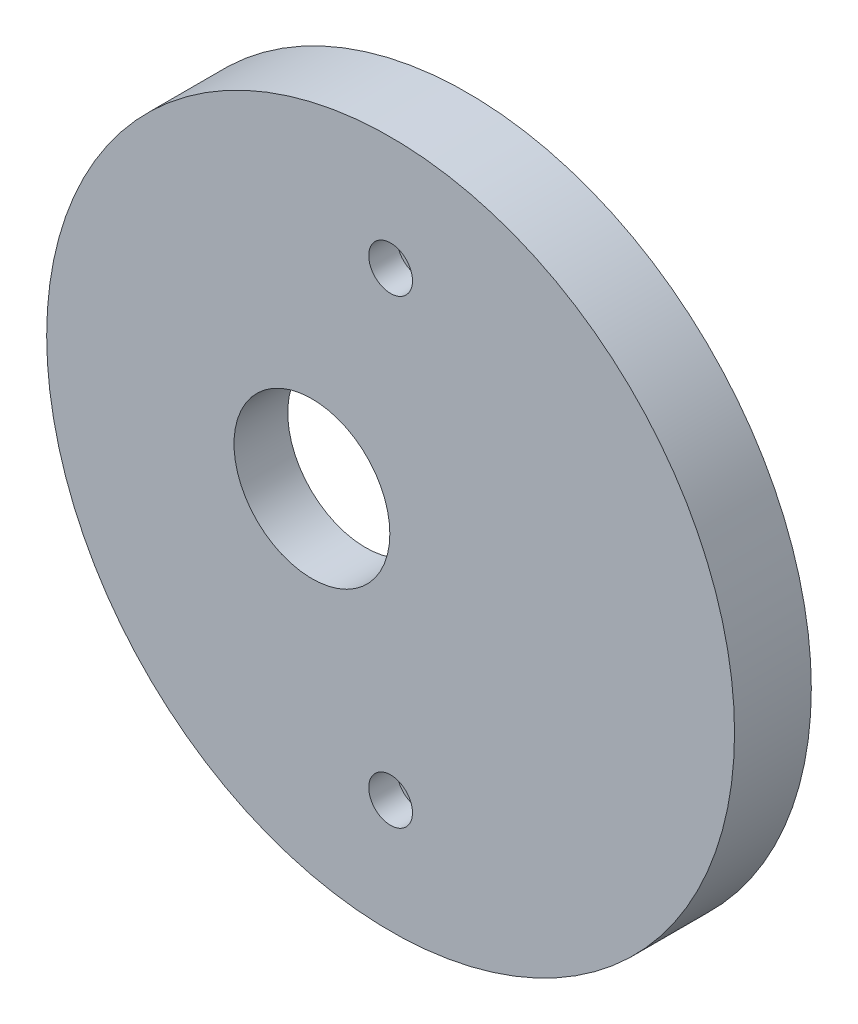
ISO-10303-21;
HEADER;
FILE_DESCRIPTION(('STEP AP214'),'2;1');
FILE_NAME('part.step','',(''),(''),'','','');
FILE_SCHEMA(('AUTOMOTIVE_DESIGN { 1 0 10303 214 1 1 1 1 }'));
ENDSEC;
DATA;
#1=APPLICATION_CONTEXT('core data for automotive mechanical design processes');
#2=APPLICATION_PROTOCOL_DEFINITION('international standard','automotive_design',2000,#1);
#3=PRODUCT_CONTEXT('',#1,'mechanical');
#4=PRODUCT('Part','Part','',(#3));
#5=PRODUCT_RELATED_PRODUCT_CATEGORY('part','',(#4));
#6=PRODUCT_DEFINITION_FORMATION('','',#4);
#7=PRODUCT_DEFINITION_CONTEXT('part definition',#1,'design');
#8=PRODUCT_DEFINITION('design','',#6,#7);
#9=PRODUCT_DEFINITION_SHAPE('','',#8);
#10=(LENGTH_UNIT() NAMED_UNIT(*) SI_UNIT(.MILLI.,.METRE.));
#11=(NAMED_UNIT(*) PLANE_ANGLE_UNIT() SI_UNIT($,.RADIAN.));
#12=(NAMED_UNIT(*) SI_UNIT($,.STERADIAN.) SOLID_ANGLE_UNIT());
#13=UNCERTAINTY_MEASURE_WITH_UNIT(LENGTH_MEASURE(1.E-05),#10,'distance_accuracy_value','');
#14=(GEOMETRIC_REPRESENTATION_CONTEXT(3) GLOBAL_UNCERTAINTY_ASSIGNED_CONTEXT((#13)) GLOBAL_UNIT_ASSIGNED_CONTEXT((#10,
#11,#12)) REPRESENTATION_CONTEXT('',''));
#15=CARTESIAN_POINT('',(0.,0.,0.));
#16=DIRECTION('',(0.,0.,1.));
#17=DIRECTION('',(1.,0.,0.));
#18=AXIS2_PLACEMENT_3D('',#15,#16,#17);
#19=CARTESIAN_POINT('',(0.,30.,7.));
#20=DIRECTION('',(0.,0.,-1.));
#21=DIRECTION('',(-1.,0.,0.));
#22=AXIS2_PLACEMENT_3D('',#19,#20,#21);
#23=CYLINDRICAL_SURFACE('',#22,1.8);
#24=CARTESIAN_POINT('',(0.,30.,0.));
#25=DIRECTION('',(0.,0.,1.));
#26=DIRECTION('',(1.,0.,0.));
#27=AXIS2_PLACEMENT_3D('',#24,#25,#26);
#28=CIRCLE('',#27,1.8);
#29=CARTESIAN_POINT('',(1.8,30.,0.));
#30=VERTEX_POINT('',#29);
#31=EDGE_CURVE('E89',#30,#30,#28,.T.);
#32=ORIENTED_EDGE('',*,*,#31,.F.);
#33=EDGE_LOOP('',(#32));
#34=FACE_BOUND('',#33,.T.);
#35=CARTESIAN_POINT('',(0.,30.,3.3));
#36=DIRECTION('',(0.,0.,1.));
#37=DIRECTION('',(1.,0.,0.));
#38=AXIS2_PLACEMENT_3D('',#35,#36,#37);
#39=CIRCLE('',#38,1.8);
#40=CARTESIAN_POINT('',(1.8,30.,3.3));
#41=VERTEX_POINT('',#40);
#42=EDGE_CURVE('E45',#41,#41,#39,.T.);
#43=ORIENTED_EDGE('',*,*,#42,.T.);
#44=EDGE_LOOP('',(#43));
#45=FACE_BOUND('',#44,.T.);
#46=ADVANCED_FACE('F41',(#34,#45),#23,.F.);
#47=CARTESIAN_POINT('',(0.,-30.,7.));
#48=DIRECTION('',(0.,0.,-1.));
#49=DIRECTION('',(-1.,0.,0.));
#50=AXIS2_PLACEMENT_3D('',#47,#48,#49);
#51=CYLINDRICAL_SURFACE('',#50,1.8);
#52=CARTESIAN_POINT('',(0.,-30.,0.));
#53=DIRECTION('',(0.,0.,1.));
#54=DIRECTION('',(-1.,0.,0.));
#55=AXIS2_PLACEMENT_3D('',#52,#53,#54);
#56=CIRCLE('',#55,1.8);
#57=CARTESIAN_POINT('',(-1.8,-30.,0.));
#58=VERTEX_POINT('',#57);
#59=EDGE_CURVE('E86',#58,#58,#56,.T.);
#60=ORIENTED_EDGE('',*,*,#59,.F.);
#61=EDGE_LOOP('',(#60));
#62=FACE_BOUND('',#61,.T.);
#63=CARTESIAN_POINT('',(0.,-30.,3.3));
#64=DIRECTION('',(0.,0.,1.));
#65=DIRECTION('',(1.,0.,0.));
#66=AXIS2_PLACEMENT_3D('',#63,#64,#65);
#67=CIRCLE('',#66,1.8);
#68=CARTESIAN_POINT('',(1.8,-30.,3.3));
#69=VERTEX_POINT('',#68);
#70=EDGE_CURVE('E57',#69,#69,#67,.T.);
#71=ORIENTED_EDGE('',*,*,#70,.T.);
#72=EDGE_LOOP('',(#71));
#73=FACE_BOUND('',#72,.T.);
#74=ADVANCED_FACE('F117',(#62,#73),#51,.F.);
#75=CARTESIAN_POINT('',(0.,0.,0.));
#76=DIRECTION('',(0.,0.,1.));
#77=DIRECTION('',(1.,0.,0.));
#78=AXIS2_PLACEMENT_3D('',#75,#76,#77);
#79=PLANE('',#78);
#80=ORIENTED_EDGE('',*,*,#59,.T.);
#81=EDGE_LOOP('',(#80));
#82=FACE_BOUND('',#81,.T.);
#83=ORIENTED_EDGE('',*,*,#31,.T.);
#84=EDGE_LOOP('',(#83));
#85=FACE_BOUND('',#84,.T.);
#86=CARTESIAN_POINT('',(-10.25,0.,0.));
#87=DIRECTION('',(0.,0.,1.));
#88=DIRECTION('',(1.,0.,0.));
#89=AXIS2_PLACEMENT_3D('',#86,#87,#88);
#90=CIRCLE('',#89,10.15);
#91=CARTESIAN_POINT('',(-0.0999999999999994,0.,0.));
#92=VERTEX_POINT('',#91);
#93=EDGE_CURVE('E54',#92,#92,#90,.T.);
#94=ORIENTED_EDGE('',*,*,#93,.T.);
#95=EDGE_LOOP('',(#94));
#96=FACE_BOUND('',#95,.T.);
#97=CARTESIAN_POINT('',(0.,0.,0.));
#98=DIRECTION('',(0.,0.,-1.));
#99=DIRECTION('',(-1.,0.,0.));
#100=AXIS2_PLACEMENT_3D('',#97,#98,#99);
#101=CIRCLE('',#100,33.5);
#102=CARTESIAN_POINT('',(-33.5,0.,0.));
#103=VERTEX_POINT('',#102);
#104=EDGE_CURVE('E63',#103,#103,#101,.T.);
#105=ORIENTED_EDGE('',*,*,#104,.T.);
#106=EDGE_LOOP('',(#105));
#107=FACE_BOUND('',#106,.T.);
#108=ADVANCED_FACE('F96',(#82,#85,#96,#107),#79,.F.);
#109=CARTESIAN_POINT('',(0.,0.,7.));
#110=DIRECTION('',(0.,0.,1.));
#111=DIRECTION('',(1.,0.,0.));
#112=AXIS2_PLACEMENT_3D('',#109,#110,#111);
#113=PLANE('',#112);
#114=CARTESIAN_POINT('',(0.,30.,7.));
#115=DIRECTION('',(0.,0.,1.));
#116=DIRECTION('',(1.,0.,0.));
#117=AXIS2_PLACEMENT_3D('',#114,#115,#116);
#118=CIRCLE('',#117,2.85);
#119=CARTESIAN_POINT('',(2.85,30.,7.));
#120=VERTEX_POINT('',#119);
#121=EDGE_CURVE('E65',#120,#120,#118,.T.);
#122=ORIENTED_EDGE('',*,*,#121,.F.);
#123=EDGE_LOOP('',(#122));
#124=FACE_BOUND('',#123,.T.);
#125=CARTESIAN_POINT('',(0.,-30.,7.));
#126=DIRECTION('',(0.,0.,1.));
#127=DIRECTION('',(1.,0.,0.));
#128=AXIS2_PLACEMENT_3D('',#125,#126,#127);
#129=CIRCLE('',#128,2.85);
#130=CARTESIAN_POINT('',(2.85,-30.,7.));
#131=VERTEX_POINT('',#130);
#132=EDGE_CURVE('E70',#131,#131,#129,.T.);
#133=ORIENTED_EDGE('',*,*,#132,.F.);
#134=EDGE_LOOP('',(#133));
#135=FACE_BOUND('',#134,.T.);
#136=CARTESIAN_POINT('',(0.,0.,7.));
#137=DIRECTION('',(0.,0.,1.));
#138=DIRECTION('',(1.,0.,0.));
#139=AXIS2_PLACEMENT_3D('',#136,#137,#138);
#140=CIRCLE('',#139,44.8);
#141=CARTESIAN_POINT('',(44.8,0.,7.));
#142=VERTEX_POINT('',#141);
#143=EDGE_CURVE('E10',#142,#142,#140,.T.);
#144=ORIENTED_EDGE('',*,*,#143,.T.);
#145=EDGE_LOOP('',(#144));
#146=FACE_BOUND('',#145,.T.);
#147=CARTESIAN_POINT('',(-10.25,0.,7.));
#148=DIRECTION('',(0.,0.,1.));
#149=DIRECTION('',(1.,0.,0.));
#150=AXIS2_PLACEMENT_3D('',#147,#148,#149);
#151=CIRCLE('',#150,10.15);
#152=CARTESIAN_POINT('',(-0.0999999999999994,0.,7.));
#153=VERTEX_POINT('',#152);
#154=EDGE_CURVE('E49',#153,#153,#151,.T.);
#155=ORIENTED_EDGE('',*,*,#154,.F.);
#156=EDGE_LOOP('',(#155));
#157=FACE_BOUND('',#156,.T.);
#158=ADVANCED_FACE('F112',(#124,#135,#146,#157),#113,.T.);
#159=CARTESIAN_POINT('',(0.,0.,7.));
#160=DIRECTION('',(0.,0.,-1.));
#161=DIRECTION('',(-1.,0.,0.));
#162=AXIS2_PLACEMENT_3D('',#159,#160,#161);
#163=CYLINDRICAL_SURFACE('',#162,44.8);
#164=ORIENTED_EDGE('',*,*,#143,.F.);
#165=EDGE_LOOP('',(#164));
#166=FACE_BOUND('',#165,.T.);
#167=CARTESIAN_POINT('',(0.,0.,-3.));
#168=DIRECTION('',(0.,0.,-1.));
#169=DIRECTION('',(-1.,0.,0.));
#170=AXIS2_PLACEMENT_3D('',#167,#168,#169);
#171=CIRCLE('',#170,44.8);
#172=CARTESIAN_POINT('',(-44.8,0.,-3.));
#173=VERTEX_POINT('',#172);
#174=EDGE_CURVE('E81',#173,#173,#171,.T.);
#175=ORIENTED_EDGE('',*,*,#174,.F.);
#176=EDGE_LOOP('',(#175));
#177=FACE_BOUND('',#176,.T.);
#178=ADVANCED_FACE('F43',(#166,#177),#163,.T.);
#179=CARTESIAN_POINT('',(-10.25,0.,7.));
#180=DIRECTION('',(0.,0.,-1.));
#181=DIRECTION('',(-1.,0.,0.));
#182=AXIS2_PLACEMENT_3D('',#179,#180,#181);
#183=CYLINDRICAL_SURFACE('',#182,10.15);
#184=ORIENTED_EDGE('',*,*,#154,.T.);
#185=EDGE_LOOP('',(#184));
#186=FACE_BOUND('',#185,.T.);
#187=ORIENTED_EDGE('',*,*,#93,.F.);
#188=EDGE_LOOP('',(#187));
#189=FACE_BOUND('',#188,.T.);
#190=ADVANCED_FACE('F99',(#186,#189),#183,.F.);
#191=CARTESIAN_POINT('',(0.,0.,-3.));
#192=DIRECTION('',(0.,0.,-1.));
#193=DIRECTION('',(-1.,0.,0.));
#194=AXIS2_PLACEMENT_3D('',#191,#192,#193);
#195=PLANE('',#194);
#196=ORIENTED_EDGE('',*,*,#174,.T.);
#197=EDGE_LOOP('',(#196));
#198=FACE_BOUND('',#197,.T.);
#199=CARTESIAN_POINT('',(0.,0.,-3.));
#200=DIRECTION('',(0.,0.,-1.));
#201=DIRECTION('',(-1.,0.,0.));
#202=AXIS2_PLACEMENT_3D('',#199,#200,#201);
#203=CIRCLE('',#202,33.5);
#204=CARTESIAN_POINT('',(-33.5,0.,-3.));
#205=VERTEX_POINT('',#204);
#206=EDGE_CURVE('E78',#205,#205,#203,.T.);
#207=ORIENTED_EDGE('',*,*,#206,.F.);
#208=EDGE_LOOP('',(#207));
#209=FACE_BOUND('',#208,.T.);
#210=ADVANCED_FACE('F101',(#198,#209),#195,.T.);
#211=CARTESIAN_POINT('',(0.,0.,-3.));
#212=DIRECTION('',(0.,0.,1.));
#213=DIRECTION('',(1.,0.,0.));
#214=AXIS2_PLACEMENT_3D('',#211,#212,#213);
#215=CYLINDRICAL_SURFACE('',#214,33.5);
#216=ORIENTED_EDGE('',*,*,#206,.T.);
#217=EDGE_LOOP('',(#216));
#218=FACE_BOUND('',#217,.T.);
#219=ORIENTED_EDGE('',*,*,#104,.F.);
#220=EDGE_LOOP('',(#219));
#221=FACE_BOUND('',#220,.T.);
#222=ADVANCED_FACE('F108',(#218,#221),#215,.F.);
#223=CARTESIAN_POINT('',(0.,-30.,3.3));
#224=DIRECTION('',(0.,0.,1.));
#225=DIRECTION('',(1.,0.,0.));
#226=AXIS2_PLACEMENT_3D('',#223,#224,#225);
#227=CYLINDRICAL_SURFACE('',#226,2.85);
#228=CARTESIAN_POINT('',(0.,-30.,3.3));
#229=DIRECTION('',(0.,0.,1.));
#230=DIRECTION('',(1.,0.,0.));
#231=AXIS2_PLACEMENT_3D('',#228,#229,#230);
#232=CIRCLE('',#231,2.85);
#233=CARTESIAN_POINT('',(2.85,-30.,3.3));
#234=VERTEX_POINT('',#233);
#235=EDGE_CURVE('E75',#234,#234,#232,.T.);
#236=ORIENTED_EDGE('',*,*,#235,.F.);
#237=EDGE_LOOP('',(#236));
#238=FACE_BOUND('',#237,.T.);
#239=ORIENTED_EDGE('',*,*,#132,.T.);
#240=EDGE_LOOP('',(#239));
#241=FACE_BOUND('',#240,.T.);
#242=ADVANCED_FACE('F128',(#238,#241),#227,.F.);
#243=CARTESIAN_POINT('',(0.,-30.,3.3));
#244=DIRECTION('',(0.,0.,1.));
#245=DIRECTION('',(1.,0.,0.));
#246=AXIS2_PLACEMENT_3D('',#243,#244,#245);
#247=PLANE('',#246);
#248=ORIENTED_EDGE('',*,*,#70,.F.);
#249=EDGE_LOOP('',(#248));
#250=FACE_BOUND('',#249,.T.);
#251=ORIENTED_EDGE('',*,*,#235,.T.);
#252=EDGE_LOOP('',(#251));
#253=FACE_BOUND('',#252,.T.);
#254=ADVANCED_FACE('F130',(#250,#253),#247,.T.);
#255=CARTESIAN_POINT('',(0.,30.,3.3));
#256=DIRECTION('',(0.,0.,1.));
#257=DIRECTION('',(1.,0.,0.));
#258=AXIS2_PLACEMENT_3D('',#255,#256,#257);
#259=CYLINDRICAL_SURFACE('',#258,2.85);
#260=CARTESIAN_POINT('',(0.,30.,3.3));
#261=DIRECTION('',(0.,0.,1.));
#262=DIRECTION('',(1.,0.,0.));
#263=AXIS2_PLACEMENT_3D('',#260,#261,#262);
#264=CIRCLE('',#263,2.85);
#265=CARTESIAN_POINT('',(2.85,30.,3.3));
#266=VERTEX_POINT('',#265);
#267=EDGE_CURVE('E59',#266,#266,#264,.T.);
#268=ORIENTED_EDGE('',*,*,#267,.F.);
#269=EDGE_LOOP('',(#268));
#270=FACE_BOUND('',#269,.T.);
#271=ORIENTED_EDGE('',*,*,#121,.T.);
#272=EDGE_LOOP('',(#271));
#273=FACE_BOUND('',#272,.T.);
#274=ADVANCED_FACE('F133',(#270,#273),#259,.F.);
#275=CARTESIAN_POINT('',(0.,30.,3.3));
#276=DIRECTION('',(0.,0.,1.));
#277=DIRECTION('',(1.,0.,0.));
#278=AXIS2_PLACEMENT_3D('',#275,#276,#277);
#279=PLANE('',#278);
#280=ORIENTED_EDGE('',*,*,#42,.F.);
#281=EDGE_LOOP('',(#280));
#282=FACE_BOUND('',#281,.T.);
#283=ORIENTED_EDGE('',*,*,#267,.T.);
#284=EDGE_LOOP('',(#283));
#285=FACE_BOUND('',#284,.T.);
#286=ADVANCED_FACE('F140',(#282,#285),#279,.T.);
#287=CLOSED_SHELL('',(#46,#74,#108,#158,#178,#190,#210,#222,#242,#254,#274,#286));
#288=MANIFOLD_SOLID_BREP('B2',#287);
#289=ADVANCED_BREP_SHAPE_REPRESENTATION('',(#18,#288),#14);
#290=SHAPE_DEFINITION_REPRESENTATION(#9,#289);
ENDSEC;
END-ISO-10303-21;
